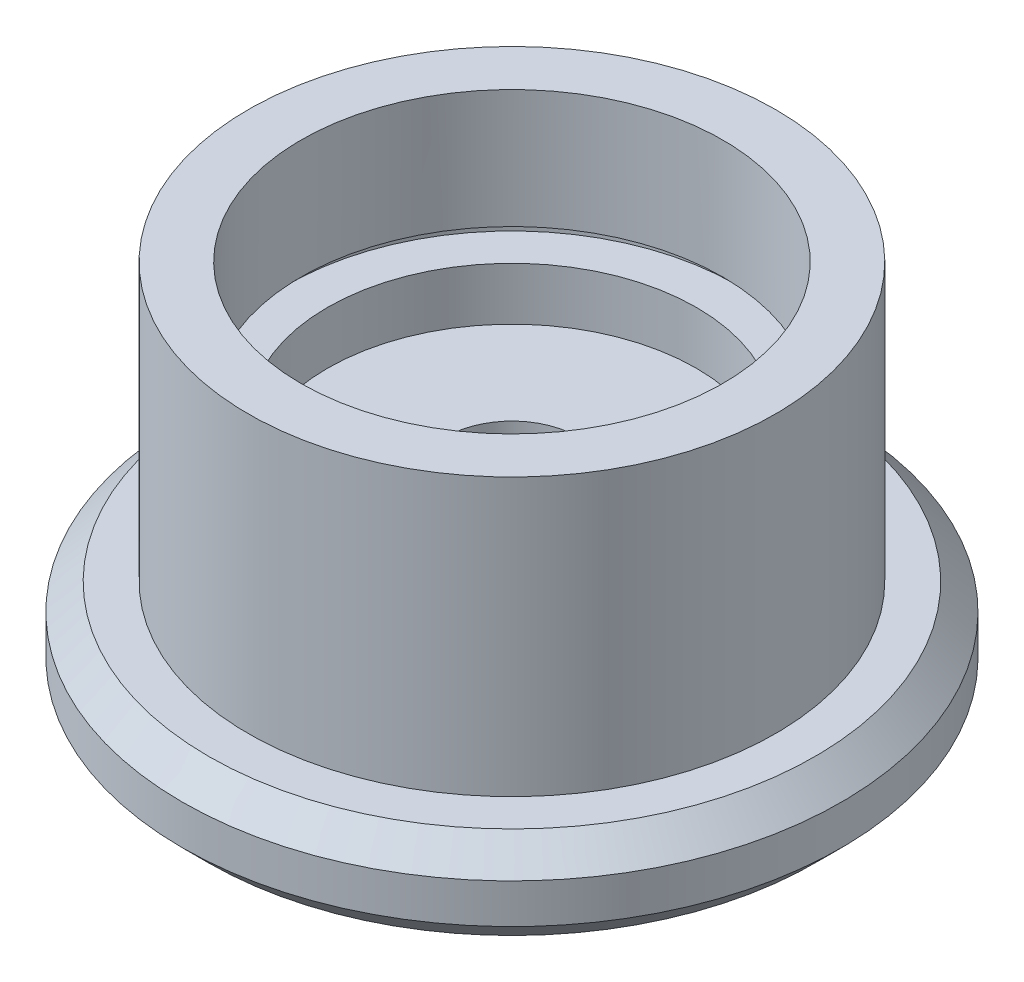
ISO-10303-21;
HEADER;
FILE_DESCRIPTION(('STEP AP214'),'2;1');
FILE_NAME('part.step','',(''),(''),'','','');
FILE_SCHEMA(('AUTOMOTIVE_DESIGN { 1 0 10303 214 1 1 1 1 }'));
ENDSEC;
DATA;
#1=APPLICATION_CONTEXT('core data for automotive mechanical design processes');
#2=APPLICATION_PROTOCOL_DEFINITION('international standard','automotive_design',2000,#1);
#3=PRODUCT_CONTEXT('',#1,'mechanical');
#4=PRODUCT('Part','Part','',(#3));
#5=PRODUCT_RELATED_PRODUCT_CATEGORY('part','',(#4));
#6=PRODUCT_DEFINITION_FORMATION('','',#4);
#7=PRODUCT_DEFINITION_CONTEXT('part definition',#1,'design');
#8=PRODUCT_DEFINITION('design','',#6,#7);
#9=PRODUCT_DEFINITION_SHAPE('','',#8);
#10=(LENGTH_UNIT() NAMED_UNIT(*) SI_UNIT(.MILLI.,.METRE.));
#11=(NAMED_UNIT(*) PLANE_ANGLE_UNIT() SI_UNIT($,.RADIAN.));
#12=(NAMED_UNIT(*) SI_UNIT($,.STERADIAN.) SOLID_ANGLE_UNIT());
#13=UNCERTAINTY_MEASURE_WITH_UNIT(LENGTH_MEASURE(1.E-05),#10,'distance_accuracy_value','');
#14=(GEOMETRIC_REPRESENTATION_CONTEXT(3) GLOBAL_UNCERTAINTY_ASSIGNED_CONTEXT((#13)) GLOBAL_UNIT_ASSIGNED_CONTEXT((#10,
#11,#12)) REPRESENTATION_CONTEXT('',''));
#15=CARTESIAN_POINT('',(0.,0.,0.));
#16=DIRECTION('',(0.,0.,1.));
#17=DIRECTION('',(1.,0.,0.));
#18=AXIS2_PLACEMENT_3D('',#15,#16,#17);
#19=CARTESIAN_POINT('',(0.,3.5,0.));
#20=DIRECTION('',(0.,-1.,0.));
#21=DIRECTION('',(0.,0.,-1.));
#22=AXIS2_PLACEMENT_3D('',#19,#20,#21);
#23=CYLINDRICAL_SURFACE('',#22,12.5);
#24=CARTESIAN_POINT('',(0.,1.00000000000001,0.));
#25=DIRECTION('',(0.,1.,0.));
#26=DIRECTION('',(0.,0.,1.));
#27=AXIS2_PLACEMENT_3D('',#24,#25,#26);
#28=CIRCLE('',#27,12.5);
#29=CARTESIAN_POINT('',(0.,1.00000000000001,12.5));
#30=VERTEX_POINT('',#29);
#31=EDGE_CURVE('E54',#30,#30,#28,.T.);
#32=ORIENTED_EDGE('',*,*,#31,.T.);
#33=EDGE_LOOP('',(#32));
#34=FACE_BOUND('',#33,.T.);
#35=CARTESIAN_POINT('',(0.,2.49999999999999,0.));
#36=DIRECTION('',(0.,1.,0.));
#37=DIRECTION('',(0.,0.,1.));
#38=AXIS2_PLACEMENT_3D('',#35,#36,#37);
#39=CIRCLE('',#38,12.5);
#40=CARTESIAN_POINT('',(0.,2.49999999999999,12.5));
#41=VERTEX_POINT('',#40);
#42=EDGE_CURVE('E59',#41,#41,#39,.F.);
#43=ORIENTED_EDGE('',*,*,#42,.T.);
#44=EDGE_LOOP('',(#43));
#45=FACE_BOUND('',#44,.T.);
#46=ADVANCED_FACE('F45',(#34,#45),#23,.T.);
#47=CARTESIAN_POINT('',(0.,3.5,0.));
#48=DIRECTION('',(0.,1.,0.));
#49=DIRECTION('',(0.,0.,1.));
#50=AXIS2_PLACEMENT_3D('',#47,#48,#49);
#51=PLANE('',#50);
#52=CARTESIAN_POINT('',(0.,3.5,0.));
#53=DIRECTION('',(0.,1.,0.));
#54=DIRECTION('',(0.,0.,1.));
#55=AXIS2_PLACEMENT_3D('',#52,#53,#54);
#56=CIRCLE('',#55,11.5);
#57=CARTESIAN_POINT('',(0.,3.5,11.5));
#58=VERTEX_POINT('',#57);
#59=EDGE_CURVE('E64',#58,#58,#56,.T.);
#60=ORIENTED_EDGE('',*,*,#59,.T.);
#61=EDGE_LOOP('',(#60));
#62=FACE_BOUND('',#61,.T.);
#63=CARTESIAN_POINT('',(0.,3.5,0.));
#64=DIRECTION('',(0.,1.,0.));
#65=DIRECTION('',(0.,0.,1.));
#66=AXIS2_PLACEMENT_3D('',#63,#64,#65);
#67=CIRCLE('',#66,10.);
#68=CARTESIAN_POINT('',(0.,3.5,-10.));
#69=VERTEX_POINT('',#68);
#70=EDGE_CURVE('E70',#69,#69,#67,.T.);
#71=ORIENTED_EDGE('',*,*,#70,.F.);
#72=EDGE_LOOP('',(#71));
#73=FACE_BOUND('',#72,.T.);
#74=ADVANCED_FACE('F127',(#62,#73),#51,.T.);
#75=CARTESIAN_POINT('',(0.,0.,0.));
#76=DIRECTION('',(0.,1.,0.));
#77=DIRECTION('',(0.,0.,1.));
#78=AXIS2_PLACEMENT_3D('',#75,#76,#77);
#79=PLANE('',#78);
#80=CARTESIAN_POINT('',(0.,0.,0.));
#81=DIRECTION('',(0.,1.,0.));
#82=DIRECTION('',(0.,0.,1.));
#83=AXIS2_PLACEMENT_3D('',#80,#81,#82);
#84=CIRCLE('',#83,11.5);
#85=CARTESIAN_POINT('',(0.,0.,11.5));
#86=VERTEX_POINT('',#85);
#87=EDGE_CURVE('E10',#86,#86,#84,.F.);
#88=ORIENTED_EDGE('',*,*,#87,.T.);
#89=EDGE_LOOP('',(#88));
#90=FACE_BOUND('',#89,.T.);
#91=CARTESIAN_POINT('',(0.,0.,0.));
#92=DIRECTION('',(0.,-1.,0.));
#93=DIRECTION('',(0.,0.,-1.));
#94=AXIS2_PLACEMENT_3D('',#91,#92,#93);
#95=CIRCLE('',#94,2.5);
#96=CARTESIAN_POINT('',(0.,0.,-2.5));
#97=VERTEX_POINT('',#96);
#98=EDGE_CURVE('E78',#97,#97,#95,.T.);
#99=ORIENTED_EDGE('',*,*,#98,.F.);
#100=EDGE_LOOP('',(#99));
#101=FACE_BOUND('',#100,.T.);
#102=ADVANCED_FACE('F123',(#90,#101),#79,.F.);
#103=CARTESIAN_POINT('',(0.,14.,0.));
#104=DIRECTION('',(0.,-1.,0.));
#105=DIRECTION('',(0.,0.,-1.));
#106=AXIS2_PLACEMENT_3D('',#103,#104,#105);
#107=CYLINDRICAL_SURFACE('',#106,10.);
#108=CARTESIAN_POINT('',(0.,14.,0.));
#109=DIRECTION('',(0.,1.,0.));
#110=DIRECTION('',(0.,0.,1.));
#111=AXIS2_PLACEMENT_3D('',#108,#109,#110);
#112=CIRCLE('',#111,10.);
#113=CARTESIAN_POINT('',(0.,14.,-10.));
#114=VERTEX_POINT('',#113);
#115=EDGE_CURVE('E74',#114,#114,#112,.T.);
#116=CARTESIAN_POINT('',(0.,14.,-10.));
#117=CARTESIAN_POINT('',(0.,13.890625,-10.));
#118=CARTESIAN_POINT('',(0.,13.78125,-10.));
#119=CARTESIAN_POINT('',(0.,13.5625,-10.));
#120=CARTESIAN_POINT('',(0.,13.453125,-10.));
#121=CARTESIAN_POINT('',(0.,13.234375,-10.));
#122=CARTESIAN_POINT('',(0.,13.125,-10.));
#123=CARTESIAN_POINT('',(0.,12.90625,-10.));
#124=CARTESIAN_POINT('',(0.,12.796875,-10.));
#125=CARTESIAN_POINT('',(0.,12.578125,-10.));
#126=CARTESIAN_POINT('',(0.,12.46875,-10.));
#127=CARTESIAN_POINT('',(0.,12.25,-10.));
#128=CARTESIAN_POINT('',(0.,12.140625,-10.));
#129=CARTESIAN_POINT('',(0.,11.921875,-10.));
#130=CARTESIAN_POINT('',(0.,11.8125,-10.));
#131=CARTESIAN_POINT('',(0.,11.59375,-10.));
#132=CARTESIAN_POINT('',(0.,11.484375,-10.));
#133=CARTESIAN_POINT('',(0.,11.265625,-10.));
#134=CARTESIAN_POINT('',(0.,11.15625,-10.));
#135=CARTESIAN_POINT('',(0.,10.9375,-10.));
#136=CARTESIAN_POINT('',(0.,10.828125,-10.));
#137=CARTESIAN_POINT('',(0.,10.609375,-10.));
#138=CARTESIAN_POINT('',(0.,10.5,-10.));
#139=CARTESIAN_POINT('',(0.,10.28125,-10.));
#140=CARTESIAN_POINT('',(0.,10.171875,-10.));
#141=CARTESIAN_POINT('',(0.,9.953125,-10.));
#142=CARTESIAN_POINT('',(0.,9.84375,-10.));
#143=CARTESIAN_POINT('',(0.,9.625,-10.));
#144=CARTESIAN_POINT('',(0.,9.515625,-10.));
#145=CARTESIAN_POINT('',(0.,9.296875,-10.));
#146=CARTESIAN_POINT('',(0.,9.1875,-10.));
#147=CARTESIAN_POINT('',(0.,8.96875,-10.));
#148=CARTESIAN_POINT('',(0.,8.859375,-10.));
#149=CARTESIAN_POINT('',(0.,8.640625,-10.));
#150=CARTESIAN_POINT('',(0.,8.53125,-10.));
#151=CARTESIAN_POINT('',(0.,8.3125,-10.));
#152=CARTESIAN_POINT('',(0.,8.203125,-10.));
#153=CARTESIAN_POINT('',(0.,7.984375,-10.));
#154=CARTESIAN_POINT('',(0.,7.875,-10.));
#155=CARTESIAN_POINT('',(0.,7.65625,-10.));
#156=CARTESIAN_POINT('',(0.,7.546875,-10.));
#157=CARTESIAN_POINT('',(0.,7.328125,-10.));
#158=CARTESIAN_POINT('',(0.,7.21875,-10.));
#159=CARTESIAN_POINT('',(0.,7.,-10.));
#160=CARTESIAN_POINT('',(0.,6.890625,-10.));
#161=CARTESIAN_POINT('',(0.,6.671875,-10.));
#162=CARTESIAN_POINT('',(0.,6.5625,-10.));
#163=CARTESIAN_POINT('',(0.,6.34375,-10.));
#164=CARTESIAN_POINT('',(0.,6.234375,-10.));
#165=CARTESIAN_POINT('',(0.,6.015625,-10.));
#166=CARTESIAN_POINT('',(0.,5.90625,-10.));
#167=CARTESIAN_POINT('',(0.,5.6875,-10.));
#168=CARTESIAN_POINT('',(0.,5.578125,-10.));
#169=CARTESIAN_POINT('',(0.,5.359375,-10.));
#170=CARTESIAN_POINT('',(0.,5.25,-10.));
#171=CARTESIAN_POINT('',(0.,5.03125,-10.));
#172=CARTESIAN_POINT('',(0.,4.921875,-10.));
#173=CARTESIAN_POINT('',(0.,4.703125,-10.));
#174=CARTESIAN_POINT('',(0.,4.59375,-10.));
#175=CARTESIAN_POINT('',(0.,4.375,-10.));
#176=CARTESIAN_POINT('',(0.,4.265625,-10.));
#177=CARTESIAN_POINT('',(0.,4.046875,-10.));
#178=CARTESIAN_POINT('',(0.,3.9375,-10.));
#179=CARTESIAN_POINT('',(0.,3.71875,-10.));
#180=CARTESIAN_POINT('',(0.,3.609375,-10.));
#181=CARTESIAN_POINT('',(0.,3.5,-10.));
#182=B_SPLINE_CURVE_WITH_KNOTS('',3,(#116,#117,#118,#119,#120,#121,#122,#123,#124,#125,#126,
#127,#128,#129,#130,#131,#132,#133,#134,#135,#136,#137,#138,#139,#140,#141,#142,#143,#144,#145,
#146,#147,#148,#149,#150,#151,#152,#153,#154,#155,#156,#157,#158,#159,#160,#161,#162,#163,#164,
#165,#166,#167,#168,#169,#170,#171,#172,#173,#174,#175,#176,#177,#178,#179,#180,#181),
.UNSPECIFIED.,.F.,.F.,(4,2,2,2,2,2,2,2,2,2,2,2,2,2,2,2,2,2,2,2,2,2,2,2,2,2,2,2,2,2,2,2,4),(0.,
0.328125,0.656250000000001,0.984375000000001,1.3125,1.640625,1.96875,2.296875,2.625,2.953125,
3.28125,3.609375,3.9375,4.265625,4.59375,4.921875,5.25,5.578125,5.90625,6.234375,6.5625,
6.890625,7.21875,7.546875,7.875,8.203125,8.53125,8.859375,9.1875,9.515625,9.84375,10.171875,
10.5),.UNSPECIFIED.);
#183=EDGE_CURVE('BSEAM117',#114,#69,#182,.T.);
#184=ORIENTED_EDGE('',*,*,#115,.F.);
#185=ORIENTED_EDGE('',*,*,#70,.T.);
#186=ORIENTED_EDGE('',*,*,#183,.T.);
#187=ORIENTED_EDGE('',*,*,#183,.F.);
#188=EDGE_LOOP('',(#184,#186,#185,#187));
#189=FACE_BOUND('',#188,.T.);
#190=ADVANCED_FACE('F117',(#189),#107,.T.);
#191=CARTESIAN_POINT('',(0.,14.,0.));
#192=DIRECTION('',(0.,1.,0.));
#193=DIRECTION('',(0.,0.,1.));
#194=AXIS2_PLACEMENT_3D('',#191,#192,#193);
#195=PLANE('',#194);
#196=CARTESIAN_POINT('',(0.,14.,0.));
#197=DIRECTION('',(0.,1.,0.));
#198=DIRECTION('',(0.,0.,1.));
#199=AXIS2_PLACEMENT_3D('',#196,#197,#198);
#200=CIRCLE('',#199,8.);
#201=CARTESIAN_POINT('',(0.,14.,8.));
#202=VERTEX_POINT('',#201);
#203=EDGE_CURVE('E106',#202,#202,#200,.T.);
#204=ORIENTED_EDGE('',*,*,#203,.F.);
#205=EDGE_LOOP('',(#204));
#206=FACE_BOUND('',#205,.T.);
#207=ORIENTED_EDGE('',*,*,#115,.T.);
#208=EDGE_LOOP('',(#207));
#209=FACE_BOUND('',#208,.T.);
#210=ADVANCED_FACE('F113',(#206,#209),#195,.T.);
#211=CARTESIAN_POINT('',(0.,7.,0.));
#212=DIRECTION('',(0.,-1.,0.));
#213=DIRECTION('',(0.,0.,-1.));
#214=AXIS2_PLACEMENT_3D('',#211,#212,#213);
#215=CYLINDRICAL_SURFACE('',#214,2.5);
#216=CARTESIAN_POINT('',(0.,7.,0.));
#217=DIRECTION('',(0.,-1.,0.));
#218=DIRECTION('',(0.,0.,-1.));
#219=AXIS2_PLACEMENT_3D('',#216,#217,#218);
#220=CIRCLE('',#219,2.5);
#221=CARTESIAN_POINT('',(0.,7.,-2.5));
#222=VERTEX_POINT('',#221);
#223=EDGE_CURVE('E82',#222,#222,#220,.T.);
#224=ORIENTED_EDGE('',*,*,#223,.F.);
#225=EDGE_LOOP('',(#224));
#226=FACE_BOUND('',#225,.T.);
#227=ORIENTED_EDGE('',*,*,#98,.T.);
#228=EDGE_LOOP('',(#227));
#229=FACE_BOUND('',#228,.T.);
#230=ADVANCED_FACE('F116',(#226,#229),#215,.F.);
#231=CARTESIAN_POINT('',(0.,9.,0.));
#232=DIRECTION('',(0.,-1.,0.));
#233=DIRECTION('',(0.,0.,-1.));
#234=AXIS2_PLACEMENT_3D('',#231,#232,#233);
#235=CYLINDRICAL_SURFACE('',#234,7.);
#236=CARTESIAN_POINT('',(0.,9.,0.));
#237=DIRECTION('',(0.,-1.,0.));
#238=DIRECTION('',(0.,0.,-1.));
#239=AXIS2_PLACEMENT_3D('',#236,#237,#238);
#240=CIRCLE('',#239,7.);
#241=CARTESIAN_POINT('',(0.,9.,-7.));
#242=VERTEX_POINT('',#241);
#243=EDGE_CURVE('E90',#242,#242,#240,.T.);
#244=ORIENTED_EDGE('',*,*,#243,.F.);
#245=EDGE_LOOP('',(#244));
#246=FACE_BOUND('',#245,.T.);
#247=CARTESIAN_POINT('',(0.,7.,0.));
#248=DIRECTION('',(0.,-1.,0.));
#249=DIRECTION('',(0.,0.,-1.));
#250=AXIS2_PLACEMENT_3D('',#247,#248,#249);
#251=CIRCLE('',#250,7.);
#252=CARTESIAN_POINT('',(0.,7.,-7.));
#253=VERTEX_POINT('',#252);
#254=EDGE_CURVE('E86',#253,#253,#251,.T.);
#255=ORIENTED_EDGE('',*,*,#254,.T.);
#256=EDGE_LOOP('',(#255));
#257=FACE_BOUND('',#256,.T.);
#258=ADVANCED_FACE('F172',(#246,#257),#235,.F.);
#259=CARTESIAN_POINT('',(0.,7.,0.));
#260=DIRECTION('',(0.,-1.,0.));
#261=DIRECTION('',(0.,0.,-1.));
#262=AXIS2_PLACEMENT_3D('',#259,#260,#261);
#263=PLANE('',#262);
#264=ORIENTED_EDGE('',*,*,#223,.T.);
#265=EDGE_LOOP('',(#264));
#266=FACE_BOUND('',#265,.T.);
#267=ORIENTED_EDGE('',*,*,#254,.F.);
#268=EDGE_LOOP('',(#267));
#269=FACE_BOUND('',#268,.T.);
#270=ADVANCED_FACE('F168',(#266,#269),#263,.F.);
#271=CARTESIAN_POINT('',(0.,9.5,0.));
#272=DIRECTION('',(0.,-1.,0.));
#273=DIRECTION('',(0.,0.,-1.));
#274=AXIS2_PLACEMENT_3D('',#271,#272,#273);
#275=CYLINDRICAL_SURFACE('',#274,8.5);
#276=CARTESIAN_POINT('',(0.,9.5,0.));
#277=DIRECTION('',(0.,-1.,0.));
#278=DIRECTION('',(0.,0.,-1.));
#279=AXIS2_PLACEMENT_3D('',#276,#277,#278);
#280=CIRCLE('',#279,8.5);
#281=CARTESIAN_POINT('',(0.,9.5,-8.5));
#282=VERTEX_POINT('',#281);
#283=EDGE_CURVE('E94',#282,#282,#280,.T.);
#284=ORIENTED_EDGE('',*,*,#283,.F.);
#285=EDGE_LOOP('',(#284));
#286=FACE_BOUND('',#285,.T.);
#287=CARTESIAN_POINT('',(0.,9.,0.));
#288=DIRECTION('',(0.,-1.,0.));
#289=DIRECTION('',(0.,0.,-1.));
#290=AXIS2_PLACEMENT_3D('',#287,#288,#289);
#291=CIRCLE('',#290,8.5);
#292=CARTESIAN_POINT('',(0.,9.,-8.5));
#293=VERTEX_POINT('',#292);
#294=EDGE_CURVE('E95',#293,#293,#291,.T.);
#295=ORIENTED_EDGE('',*,*,#294,.T.);
#296=EDGE_LOOP('',(#295));
#297=FACE_BOUND('',#296,.T.);
#298=ADVANCED_FACE('F163',(#286,#297),#275,.F.);
#299=CARTESIAN_POINT('',(0.,9.5,0.));
#300=DIRECTION('',(0.,-1.,0.));
#301=DIRECTION('',(0.,0.,-1.));
#302=AXIS2_PLACEMENT_3D('',#299,#300,#301);
#303=PLANE('',#302);
#304=CARTESIAN_POINT('',(0.,9.5,0.));
#305=DIRECTION('',(0.,-1.,0.));
#306=DIRECTION('',(0.,0.,-1.));
#307=AXIS2_PLACEMENT_3D('',#304,#305,#306);
#308=CIRCLE('',#307,8.);
#309=CARTESIAN_POINT('',(0.,9.5,-8.));
#310=VERTEX_POINT('',#309);
#311=EDGE_CURVE('E99',#310,#310,#308,.T.);
#312=ORIENTED_EDGE('',*,*,#311,.F.);
#313=EDGE_LOOP('',(#312));
#314=FACE_BOUND('',#313,.T.);
#315=ORIENTED_EDGE('',*,*,#283,.T.);
#316=EDGE_LOOP('',(#315));
#317=FACE_BOUND('',#316,.T.);
#318=ADVANCED_FACE('F158',(#314,#317),#303,.T.);
#319=CARTESIAN_POINT('',(0.,9.,0.));
#320=DIRECTION('',(0.,-1.,0.));
#321=DIRECTION('',(0.,0.,-1.));
#322=AXIS2_PLACEMENT_3D('',#319,#320,#321);
#323=PLANE('',#322);
#324=ORIENTED_EDGE('',*,*,#294,.F.);
#325=EDGE_LOOP('',(#324));
#326=FACE_BOUND('',#325,.T.);
#327=ORIENTED_EDGE('',*,*,#243,.T.);
#328=EDGE_LOOP('',(#327));
#329=FACE_BOUND('',#328,.T.);
#330=ADVANCED_FACE('F148',(#326,#329),#323,.F.);
#331=CARTESIAN_POINT('',(0.,9.,0.));
#332=DIRECTION('',(0.,1.,0.));
#333=DIRECTION('',(0.,0.,1.));
#334=AXIS2_PLACEMENT_3D('',#331,#332,#333);
#335=CYLINDRICAL_SURFACE('',#334,8.);
#336=ORIENTED_EDGE('',*,*,#311,.T.);
#337=EDGE_LOOP('',(#336));
#338=FACE_BOUND('',#337,.T.);
#339=ORIENTED_EDGE('',*,*,#203,.T.);
#340=EDGE_LOOP('',(#339));
#341=FACE_BOUND('',#340,.T.);
#342=ADVANCED_FACE('F111',(#338,#341),#335,.F.);
#343=CARTESIAN_POINT('',(0.,3.5,0.));
#344=DIRECTION('',(0.,-1.,0.));
#345=DIRECTION('',(0.,0.,-1.));
#346=AXIS2_PLACEMENT_3D('',#343,#344,#345);
#347=CONICAL_SURFACE('',#346,11.5,0.785398163397446);
#348=ORIENTED_EDGE('',*,*,#42,.F.);
#349=EDGE_LOOP('',(#348));
#350=FACE_BOUND('',#349,.T.);
#351=ORIENTED_EDGE('',*,*,#59,.F.);
#352=EDGE_LOOP('',(#351));
#353=FACE_BOUND('',#352,.T.);
#354=ADVANCED_FACE('F140',(#350,#353),#347,.T.);
#355=CARTESIAN_POINT('',(0.,1.00000000000001,0.));
#356=DIRECTION('',(0.,1.,0.));
#357=DIRECTION('',(0.,0.,1.));
#358=AXIS2_PLACEMENT_3D('',#355,#356,#357);
#359=CONICAL_SURFACE('',#358,12.5,0.785398163397449);
#360=ORIENTED_EDGE('',*,*,#87,.F.);
#361=EDGE_LOOP('',(#360));
#362=FACE_BOUND('',#361,.T.);
#363=ORIENTED_EDGE('',*,*,#31,.F.);
#364=EDGE_LOOP('',(#363));
#365=FACE_BOUND('',#364,.T.);
#366=ADVANCED_FACE('F48',(#362,#365),#359,.T.);
#367=CLOSED_SHELL('',(#46,#74,#102,#190,#210,#230,#258,#270,#298,#318,#330,#342,#354,#366));
#368=MANIFOLD_SOLID_BREP('B2',#367);
#369=ADVANCED_BREP_SHAPE_REPRESENTATION('',(#18,#368),#14);
#370=SHAPE_DEFINITION_REPRESENTATION(#9,#369);
ENDSEC;
END-ISO-10303-21;
